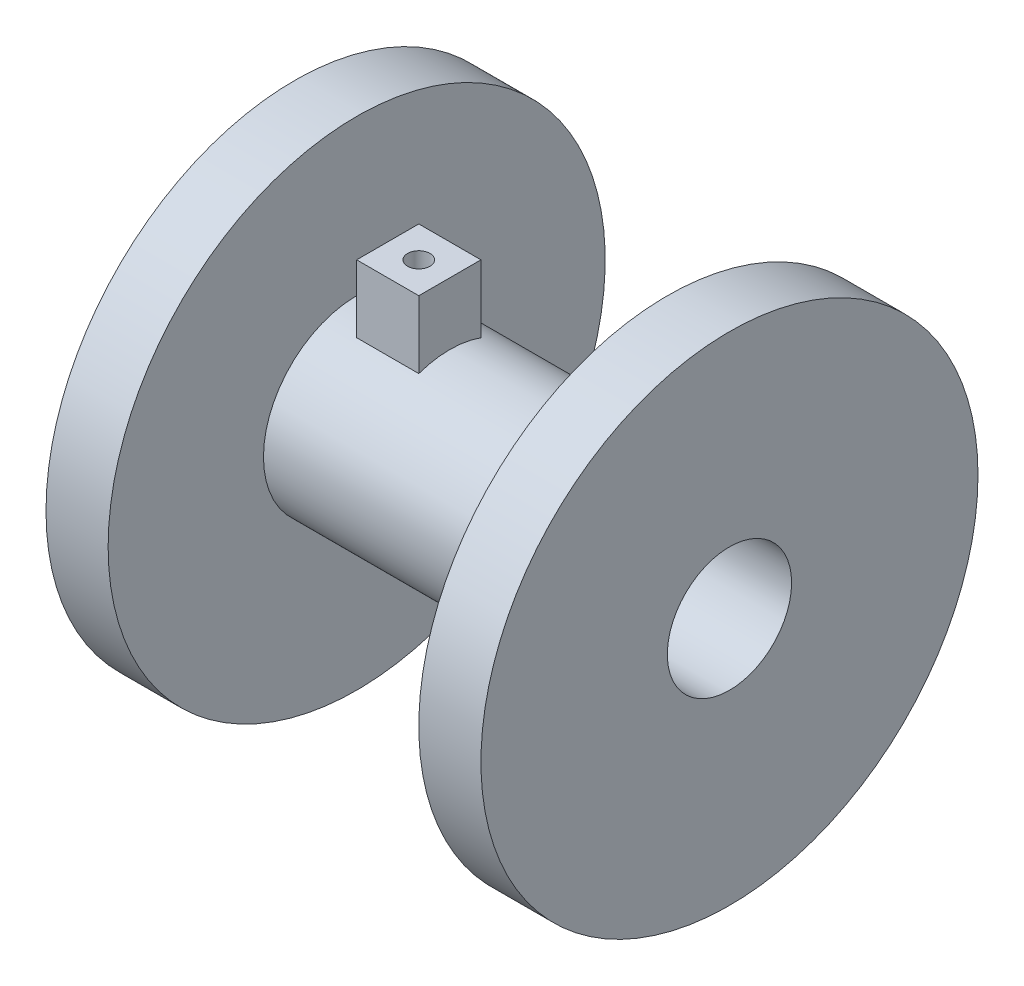
ISO-10303-21;
HEADER;
FILE_DESCRIPTION(('STEP AP214'),'2;1');
FILE_NAME('part.step','',(''),(''),'','','');
FILE_SCHEMA(('AUTOMOTIVE_DESIGN { 1 0 10303 214 1 1 1 1 }'));
ENDSEC;
DATA;
#1=APPLICATION_CONTEXT('core data for automotive mechanical design processes');
#2=APPLICATION_PROTOCOL_DEFINITION('international standard','automotive_design',2000,#1);
#3=PRODUCT_CONTEXT('',#1,'mechanical');
#4=PRODUCT('Part','Part','',(#3));
#5=PRODUCT_RELATED_PRODUCT_CATEGORY('part','',(#4));
#6=PRODUCT_DEFINITION_FORMATION('','',#4);
#7=PRODUCT_DEFINITION_CONTEXT('part definition',#1,'design');
#8=PRODUCT_DEFINITION('design','',#6,#7);
#9=PRODUCT_DEFINITION_SHAPE('','',#8);
#10=(LENGTH_UNIT() NAMED_UNIT(*) SI_UNIT(.MILLI.,.METRE.));
#11=(NAMED_UNIT(*) PLANE_ANGLE_UNIT() SI_UNIT($,.RADIAN.));
#12=(NAMED_UNIT(*) SI_UNIT($,.STERADIAN.) SOLID_ANGLE_UNIT());
#13=UNCERTAINTY_MEASURE_WITH_UNIT(LENGTH_MEASURE(1.E-05),#10,'distance_accuracy_value','');
#14=(GEOMETRIC_REPRESENTATION_CONTEXT(3) GLOBAL_UNCERTAINTY_ASSIGNED_CONTEXT((#13)) GLOBAL_UNIT_ASSIGNED_CONTEXT((#10,
#11,#12)) REPRESENTATION_CONTEXT('',''));
#15=CARTESIAN_POINT('',(0.,0.,0.));
#16=DIRECTION('',(0.,0.,1.));
#17=DIRECTION('',(1.,0.,0.));
#18=AXIS2_PLACEMENT_3D('',#15,#16,#17);
#19=CARTESIAN_POINT('',(44.45,0.,0.));
#20=DIRECTION('',(-1.,0.,0.));
#21=DIRECTION('',(0.,0.,1.));
#22=AXIS2_PLACEMENT_3D('',#19,#20,#21);
#23=CYLINDRICAL_SURFACE('',#22,19.05);
#24=CARTESIAN_POINT('',(-25.4,0.,0.));
#25=DIRECTION('',(-1.,0.,0.));
#26=DIRECTION('',(0.,0.,1.));
#27=AXIS2_PLACEMENT_3D('',#24,#25,#26);
#28=CIRCLE('',#27,19.05);
#29=CARTESIAN_POINT('',(-25.4,17.9605122421383,-6.35));
#30=VERTEX_POINT('',#29);
#31=CARTESIAN_POINT('',(-25.4,17.9605122421383,6.35));
#32=VERTEX_POINT('',#31);
#33=EDGE_CURVE('E110',#30,#32,#28,.F.);
#34=ORIENTED_EDGE('',*,*,#33,.F.);
#35=DIRECTION('',(-1.,0.,0.));
#36=VECTOR('',#35,1.);
#37=CARTESIAN_POINT('',(44.45,17.9605122421383,-6.35));
#38=LINE('',#37,#36);
#39=CARTESIAN_POINT('',(-12.7,17.9605122421549,-6.35));
#40=VERTEX_POINT('',#39);
#41=EDGE_CURVE('E100',#40,#30,#38,.T.);
#42=ORIENTED_EDGE('',*,*,#41,.F.);
#43=CARTESIAN_POINT('',(-12.7,0.,0.));
#44=DIRECTION('',(1.,0.,0.));
#45=DIRECTION('',(0.,0.,-1.));
#46=AXIS2_PLACEMENT_3D('',#43,#44,#45);
#47=CIRCLE('',#46,19.05);
#48=CARTESIAN_POINT('',(-12.7,17.9605122421549,6.35));
#49=VERTEX_POINT('',#48);
#50=EDGE_CURVE('E91',#49,#40,#47,.F.);
#51=ORIENTED_EDGE('',*,*,#50,.F.);
#52=DIRECTION('',(-1.,0.,0.));
#53=VECTOR('',#52,1.);
#54=CARTESIAN_POINT('',(44.45,17.9605122421383,6.35));
#55=LINE('',#54,#53);
#56=EDGE_CURVE('E106',#32,#49,#55,.F.);
#57=ORIENTED_EDGE('',*,*,#56,.F.);
#58=EDGE_LOOP('',(#34,#42,#51,#57));
#59=FACE_BOUND('',#58,.T.);
#60=CARTESIAN_POINT('',(31.75,0.,0.));
#61=DIRECTION('',(1.,0.,0.));
#62=DIRECTION('',(0.,0.,-1.));
#63=AXIS2_PLACEMENT_3D('',#60,#61,#62);
#64=CIRCLE('',#63,19.05);
#65=CARTESIAN_POINT('',(31.75,0.,-19.05));
#66=VERTEX_POINT('',#65);
#67=EDGE_CURVE('E130',#66,#66,#64,.T.);
#68=ORIENTED_EDGE('',*,*,#67,.F.);
#69=EDGE_LOOP('',(#68));
#70=FACE_BOUND('',#69,.T.);
#71=CARTESIAN_POINT('',(-31.75,0.,0.));
#72=DIRECTION('',(-1.,0.,0.));
#73=DIRECTION('',(0.,0.,1.));
#74=AXIS2_PLACEMENT_3D('',#71,#72,#73);
#75=CIRCLE('',#74,19.05);
#76=CARTESIAN_POINT('',(-31.75,0.,19.05));
#77=VERTEX_POINT('',#76);
#78=EDGE_CURVE('E57',#77,#77,#75,.T.);
#79=ORIENTED_EDGE('',*,*,#78,.F.);
#80=EDGE_LOOP('',(#79));
#81=FACE_BOUND('',#80,.T.);
#82=ADVANCED_FACE('F46',(#59,#70,#81),#23,.T.);
#83=CARTESIAN_POINT('',(44.45,0.,0.));
#84=DIRECTION('',(1.,0.,0.));
#85=DIRECTION('',(0.,0.,-1.));
#86=AXIS2_PLACEMENT_3D('',#83,#84,#85);
#87=PLANE('',#86);
#88=CARTESIAN_POINT('',(44.45,0.,0.));
#89=DIRECTION('',(1.,0.,0.));
#90=DIRECTION('',(0.,0.,-1.));
#91=AXIS2_PLACEMENT_3D('',#88,#89,#90);
#92=CIRCLE('',#91,12.7);
#93=CARTESIAN_POINT('',(44.45,0.,-12.7));
#94=VERTEX_POINT('',#93);
#95=EDGE_CURVE('E139',#94,#94,#92,.T.);
#96=ORIENTED_EDGE('',*,*,#95,.F.);
#97=EDGE_LOOP('',(#96));
#98=FACE_BOUND('',#97,.T.);
#99=CARTESIAN_POINT('',(44.45,0.,0.));
#100=DIRECTION('',(1.,0.,0.));
#101=DIRECTION('',(0.,0.,-1.));
#102=AXIS2_PLACEMENT_3D('',#99,#100,#101);
#103=CIRCLE('',#102,50.8);
#104=CARTESIAN_POINT('',(44.45,0.,-50.8));
#105=VERTEX_POINT('',#104);
#106=EDGE_CURVE('E123',#105,#105,#103,.T.);
#107=ORIENTED_EDGE('',*,*,#106,.T.);
#108=EDGE_LOOP('',(#107));
#109=FACE_BOUND('',#108,.T.);
#110=ADVANCED_FACE('F154',(#98,#109),#87,.T.);
#111=CARTESIAN_POINT('',(-44.45,0.,0.));
#112=DIRECTION('',(1.,0.,0.));
#113=DIRECTION('',(0.,0.,-1.));
#114=AXIS2_PLACEMENT_3D('',#111,#112,#113);
#115=PLANE('',#114);
#116=CARTESIAN_POINT('',(-44.45,0.,0.));
#117=DIRECTION('',(1.,0.,0.));
#118=DIRECTION('',(0.,0.,-1.));
#119=AXIS2_PLACEMENT_3D('',#116,#117,#118);
#120=CIRCLE('',#119,12.7);
#121=CARTESIAN_POINT('',(-44.45,0.,-12.7));
#122=VERTEX_POINT('',#121);
#123=EDGE_CURVE('E134',#122,#122,#120,.T.);
#124=ORIENTED_EDGE('',*,*,#123,.T.);
#125=EDGE_LOOP('',(#124));
#126=FACE_BOUND('',#125,.T.);
#127=CARTESIAN_POINT('',(-44.45,0.,0.));
#128=DIRECTION('',(-1.,0.,0.));
#129=DIRECTION('',(0.,0.,1.));
#130=AXIS2_PLACEMENT_3D('',#127,#128,#129);
#131=CIRCLE('',#130,50.8);
#132=CARTESIAN_POINT('',(-44.45,0.,50.8));
#133=VERTEX_POINT('',#132);
#134=EDGE_CURVE('E124',#133,#133,#131,.T.);
#135=ORIENTED_EDGE('',*,*,#134,.T.);
#136=EDGE_LOOP('',(#135));
#137=FACE_BOUND('',#136,.T.);
#138=ADVANCED_FACE('F144',(#126,#137),#115,.F.);
#139=CARTESIAN_POINT('',(44.45,0.,0.));
#140=DIRECTION('',(-1.,0.,0.));
#141=DIRECTION('',(0.,0.,1.));
#142=AXIS2_PLACEMENT_3D('',#139,#140,#141);
#143=CYLINDRICAL_SURFACE('',#142,12.7);
#144=ORIENTED_EDGE('',*,*,#123,.F.);
#145=EDGE_LOOP('',(#144));
#146=FACE_BOUND('',#145,.T.);
#147=ORIENTED_EDGE('',*,*,#95,.T.);
#148=EDGE_LOOP('',(#147));
#149=FACE_BOUND('',#148,.T.);
#150=ADVANCED_FACE('F147',(#146,#149),#143,.F.);
#151=CARTESIAN_POINT('',(31.75,0.,0.));
#152=DIRECTION('',(1.,0.,0.));
#153=DIRECTION('',(0.,0.,-1.));
#154=AXIS2_PLACEMENT_3D('',#151,#152,#153);
#155=PLANE('',#154);
#156=CARTESIAN_POINT('',(31.75,0.,0.));
#157=DIRECTION('',(1.,0.,0.));
#158=DIRECTION('',(0.,0.,-1.));
#159=AXIS2_PLACEMENT_3D('',#156,#157,#158);
#160=CIRCLE('',#159,50.8);
#161=CARTESIAN_POINT('',(31.75,0.,-50.8));
#162=VERTEX_POINT('',#161);
#163=EDGE_CURVE('E131',#162,#162,#160,.T.);
#164=ORIENTED_EDGE('',*,*,#163,.F.);
#165=EDGE_LOOP('',(#164));
#166=FACE_BOUND('',#165,.T.);
#167=ORIENTED_EDGE('',*,*,#67,.T.);
#168=EDGE_LOOP('',(#167));
#169=FACE_BOUND('',#168,.T.);
#170=ADVANCED_FACE('F150',(#166,#169),#155,.F.);
#171=CARTESIAN_POINT('',(31.75,0.,0.));
#172=DIRECTION('',(1.,0.,0.));
#173=DIRECTION('',(0.,0.,-1.));
#174=AXIS2_PLACEMENT_3D('',#171,#172,#173);
#175=CYLINDRICAL_SURFACE('',#174,50.8);
#176=ORIENTED_EDGE('',*,*,#163,.T.);
#177=EDGE_LOOP('',(#176));
#178=FACE_BOUND('',#177,.T.);
#179=ORIENTED_EDGE('',*,*,#106,.F.);
#180=EDGE_LOOP('',(#179));
#181=FACE_BOUND('',#180,.T.);
#182=ADVANCED_FACE('F160',(#178,#181),#175,.T.);
#183=CARTESIAN_POINT('',(-31.75,0.,0.));
#184=DIRECTION('',(-1.,0.,0.));
#185=DIRECTION('',(0.,0.,1.));
#186=AXIS2_PLACEMENT_3D('',#183,#184,#185);
#187=PLANE('',#186);
#188=CARTESIAN_POINT('',(-31.75,0.,0.));
#189=DIRECTION('',(-1.,0.,0.));
#190=DIRECTION('',(0.,0.,1.));
#191=AXIS2_PLACEMENT_3D('',#188,#189,#190);
#192=CIRCLE('',#191,50.8);
#193=CARTESIAN_POINT('',(-31.75,0.,50.8));
#194=VERTEX_POINT('',#193);
#195=EDGE_CURVE('E120',#194,#194,#192,.T.);
#196=ORIENTED_EDGE('',*,*,#195,.F.);
#197=EDGE_LOOP('',(#196));
#198=FACE_BOUND('',#197,.T.);
#199=ORIENTED_EDGE('',*,*,#78,.T.);
#200=EDGE_LOOP('',(#199));
#201=FACE_BOUND('',#200,.T.);
#202=ADVANCED_FACE('F162',(#198,#201),#187,.F.);
#203=CARTESIAN_POINT('',(-31.75,0.,0.));
#204=DIRECTION('',(-1.,0.,0.));
#205=DIRECTION('',(0.,0.,1.));
#206=AXIS2_PLACEMENT_3D('',#203,#204,#205);
#207=CYLINDRICAL_SURFACE('',#206,50.8);
#208=ORIENTED_EDGE('',*,*,#195,.T.);
#209=EDGE_LOOP('',(#208));
#210=FACE_BOUND('',#209,.T.);
#211=ORIENTED_EDGE('',*,*,#134,.F.);
#212=EDGE_LOOP('',(#211));
#213=FACE_BOUND('',#212,.T.);
#214=ADVANCED_FACE('F169',(#210,#213),#207,.T.);
#215=CARTESIAN_POINT('',(-25.4,-500000.,-6.35));
#216=DIRECTION('',(0.,0.,-1.));
#217=DIRECTION('',(-1.,0.,0.));
#218=AXIS2_PLACEMENT_3D('',#215,#216,#217);
#219=PLANE('',#218);
#220=DIRECTION('',(0.,1.,0.));
#221=VECTOR('',#220,1.);
#222=CARTESIAN_POINT('',(-12.7,-500000.,-6.35));
#223=LINE('',#222,#221);
#224=CARTESIAN_POINT('',(-12.7,31.75,-6.35));
#225=VERTEX_POINT('',#224);
#226=EDGE_CURVE('E95',#40,#225,#223,.T.);
#227=ORIENTED_EDGE('',*,*,#226,.F.);
#228=ORIENTED_EDGE('',*,*,#41,.T.);
#229=DIRECTION('',(0.,1.,0.));
#230=VECTOR('',#229,1.);
#231=CARTESIAN_POINT('',(-25.4,-500000.,-6.35));
#232=LINE('',#231,#230);
#233=CARTESIAN_POINT('',(-25.4,31.75,-6.35));
#234=VERTEX_POINT('',#233);
#235=EDGE_CURVE('E72',#30,#234,#232,.T.);
#236=ORIENTED_EDGE('',*,*,#235,.T.);
#237=DIRECTION('',(-1.,0.,0.));
#238=VECTOR('',#237,1.);
#239=CARTESIAN_POINT('',(-25.4,31.75,-6.35));
#240=LINE('',#239,#238);
#241=EDGE_CURVE('E104',#225,#234,#240,.T.);
#242=ORIENTED_EDGE('',*,*,#241,.F.);
#243=EDGE_LOOP('',(#227,#228,#236,#242));
#244=FACE_BOUND('',#243,.T.);
#245=ADVANCED_FACE('F102',(#244),#219,.T.);
#246=CARTESIAN_POINT('',(-12.7,31.75,-6.35));
#247=DIRECTION('',(0.,-1.,0.));
#248=DIRECTION('',(0.,0.,-1.));
#249=AXIS2_PLACEMENT_3D('',#246,#247,#248);
#250=PLANE('',#249);
#251=DIRECTION('',(0.,0.,-1.));
#252=VECTOR('',#251,1.);
#253=CARTESIAN_POINT('',(-12.7,31.75,6.35));
#254=LINE('',#253,#252);
#255=CARTESIAN_POINT('',(-12.7,31.75,6.35));
#256=VERTEX_POINT('',#255);
#257=EDGE_CURVE('E127',#256,#225,#254,.T.);
#258=ORIENTED_EDGE('',*,*,#257,.T.);
#259=ORIENTED_EDGE('',*,*,#241,.T.);
#260=DIRECTION('',(0.,0.,1.));
#261=VECTOR('',#260,1.);
#262=CARTESIAN_POINT('',(-25.4,31.75,6.35));
#263=LINE('',#262,#261);
#264=CARTESIAN_POINT('',(-25.4,31.75,6.35));
#265=VERTEX_POINT('',#264);
#266=EDGE_CURVE('E210',#234,#265,#263,.T.);
#267=ORIENTED_EDGE('',*,*,#266,.T.);
#268=DIRECTION('',(1.,0.,0.));
#269=VECTOR('',#268,1.);
#270=CARTESIAN_POINT('',(-25.4,31.75,6.35));
#271=LINE('',#270,#269);
#272=EDGE_CURVE('E212',#265,#256,#271,.T.);
#273=ORIENTED_EDGE('',*,*,#272,.T.);
#274=EDGE_LOOP('',(#258,#259,#267,#273));
#275=FACE_BOUND('',#274,.T.);
#276=CARTESIAN_POINT('',(-19.05,31.75,0.));
#277=DIRECTION('',(0.,1.,0.));
#278=DIRECTION('',(0.,0.,1.));
#279=AXIS2_PLACEMENT_3D('',#276,#277,#278);
#280=CIRCLE('',#279,2.286);
#281=CARTESIAN_POINT('',(-19.05,31.75,2.286));
#282=VERTEX_POINT('',#281);
#283=EDGE_CURVE('E117',#282,#282,#280,.T.);
#284=ORIENTED_EDGE('',*,*,#283,.F.);
#285=EDGE_LOOP('',(#284));
#286=FACE_BOUND('',#285,.T.);
#287=ADVANCED_FACE('F188',(#275,#286),#250,.F.);
#288=CARTESIAN_POINT('',(-19.05,-500000.,0.));
#289=DIRECTION('',(0.,1.,0.));
#290=DIRECTION('',(0.,0.,1.));
#291=AXIS2_PLACEMENT_3D('',#288,#289,#290);
#292=CYLINDRICAL_SURFACE('',#291,2.286);
#293=ORIENTED_EDGE('',*,*,#283,.T.);
#294=EDGE_LOOP('',(#293));
#295=FACE_BOUND('',#294,.T.);
#296=CARTESIAN_POINT('',(-19.05,18.9123426364901,2.286));
#297=CARTESIAN_POINT('',(-19.1779086655937,18.912344408558,2.28599453777581));
#298=CARTESIAN_POINT('',(-19.305898284354,18.9136542560225,2.27522847083811));
#299=CARTESIAN_POINT('',(-19.5583184743883,18.9187504146085,2.23244906856361));
#300=CARTESIAN_POINT('',(-19.682745137113,18.9225393442396,2.20041326672093));
#301=CARTESIAN_POINT('',(-19.9243480649944,18.93215846091,2.11604987977414));
#302=CARTESIAN_POINT('',(-20.0415290769839,18.9379872945147,2.06373574645828));
#303=CARTESIAN_POINT('',(-20.2654259222828,18.9510278203983,1.94032889219113));
#304=CARTESIAN_POINT('',(-20.3721436027753,18.9582392679255,1.86923949401545));
#305=CARTESIAN_POINT('',(-20.5726587059664,18.9732742241852,1.709906236747));
#306=CARTESIAN_POINT('',(-20.6663942482935,18.9811004032235,1.62158474704995));
#307=CARTESIAN_POINT('',(-20.8377500832395,18.9964589528062,1.43046134863375));
#308=CARTESIAN_POINT('',(-20.9153695884877,19.0039913089809,1.32765873283125));
#309=CARTESIAN_POINT('',(-21.0525104980974,19.0179406805588,1.11010413117261));
#310=CARTESIAN_POINT('',(-21.1119761267936,19.0243542332071,0.995316744832935));
#311=CARTESIAN_POINT('',(-21.2107641268132,19.0353140687346,0.757295234661857));
#312=CARTESIAN_POINT('',(-21.2500871896678,19.0398604157173,0.634061400977185));
#313=CARTESIAN_POINT('',(-21.3072895591508,19.0465547941289,0.383276747022637));
#314=CARTESIAN_POINT('',(-21.3252715379257,19.0487143051679,0.255749656935058));
#315=CARTESIAN_POINT('',(-21.3395993826746,19.0504308626969,-0.000529206461443951));
#316=CARTESIAN_POINT('',(-21.3359460368046,19.049988003989,-0.129280934987272));
#317=CARTESIAN_POINT('',(-21.3071894491493,19.0465590309053,-0.383656078648356));
#318=CARTESIAN_POINT('',(-21.282196624011,19.0435860085866,-0.509292177426976));
#319=CARTESIAN_POINT('',(-21.2116430083924,19.0354455273854,-0.754573830009475));
#320=CARTESIAN_POINT('',(-21.1660818530336,19.0302780295735,-0.874219277498462));
#321=CARTESIAN_POINT('',(-21.0555666805732,19.018306736327,-1.10446651592364));
#322=CARTESIAN_POINT('',(-20.9905646461631,19.0114988975783,-1.21504504052384));
#323=CARTESIAN_POINT('',(-20.8430477989954,18.9970090696977,-1.42376569719147));
#324=CARTESIAN_POINT('',(-20.7605322458713,18.9893270436166,-1.52190730322037));
#325=CARTESIAN_POINT('',(-20.5797116856502,18.9738919539915,-1.70361651495763));
#326=CARTESIAN_POINT('',(-20.4813104865934,18.9661387477997,-1.78708841625324));
#327=CARTESIAN_POINT('',(-20.2718429865762,18.9514830047109,-1.93634556970769));
#328=CARTESIAN_POINT('',(-20.1607766513167,18.9445804701177,-2.0021307739666));
#329=CARTESIAN_POINT('',(-19.9290489225077,18.9324075546074,-2.11415130909291));
#330=CARTESIAN_POINT('',(-19.8083839737615,18.927137782014,-2.16037935582122));
#331=CARTESIAN_POINT('',(-19.5609268220601,18.9188390969638,-2.23189045644671));
#332=CARTESIAN_POINT('',(-19.4341348907691,18.9158100852509,-2.25717443808216));
#333=CARTESIAN_POINT('',(-19.178867080561,18.9123538451915,-2.2859537367867));
#334=CARTESIAN_POINT('',(-19.0504065758586,18.9119105551203,-2.28958356614328));
#335=CARTESIAN_POINT('',(-18.7947080689977,18.9136334935473,-2.27530607718369));
#336=CARTESIAN_POINT('',(-18.6674700429222,18.9157996708879,-2.25739918108731));
#337=CARTESIAN_POINT('',(-18.4182290128983,18.9224828261534,-2.20066965459818));
#338=CARTESIAN_POINT('',(-18.2962110477313,18.9269925194845,-2.1619118242419));
#339=CARTESIAN_POINT('',(-18.0604063863723,18.9378486764175,-2.06464720515979));
#340=CARTESIAN_POINT('',(-17.9466199579687,18.9441951997416,-2.00613977429062));
#341=CARTESIAN_POINT('',(-17.7298987832293,18.9580484932734,-1.87070468673867));
#342=CARTESIAN_POINT('',(-17.6270196453964,18.965560769071,-1.79368861841805));
#343=CARTESIAN_POINT('',(-17.435600043885,18.9808816881761,-1.62354781591571));
#344=CARTESIAN_POINT('',(-17.3470600936647,18.988690342084,-1.53042250514039));
#345=CARTESIAN_POINT('',(-17.186361552607,19.0037733420022,-1.3301199757728));
#346=CARTESIAN_POINT('',(-17.1142912121583,19.0110446745095,-1.22287169655639));
#347=CARTESIAN_POINT('',(-16.9891876044912,19.0241889592544,-0.99771435921086));
#348=CARTESIAN_POINT('',(-16.9361539795107,19.0300619377709,-0.879805501481044));
#349=CARTESIAN_POINT('',(-16.8507757942846,19.0397343688052,-0.636970464476628));
#350=CARTESIAN_POINT('',(-16.8183797338482,19.0435389793403,-0.51206260603315));
#351=CARTESIAN_POINT('',(-16.7750286213904,19.0486673659754,-0.258531805763503));
#352=CARTESIAN_POINT('',(-16.7640726820798,19.0499912447393,-0.129909017901478));
#353=CARTESIAN_POINT('',(-16.7639284907864,19.0500086143069,0.126537724766815));
#354=CARTESIAN_POINT('',(-16.7746039640474,19.048718572432,0.254361623350062));
#355=CARTESIAN_POINT('',(-16.8171315586357,19.0436857176378,0.506384985294732));
#356=CARTESIAN_POINT('',(-16.8489836730215,19.0399429055226,0.630584449844192));
#357=CARTESIAN_POINT('',(-16.9329186475303,19.0304233070851,0.871819101659518));
#358=CARTESIAN_POINT('',(-16.9849955177143,19.0246471230312,0.988856398265977));
#359=CARTESIAN_POINT('',(-17.1078876050233,19.0117013041689,1.21255186282029));
#360=CARTESIAN_POINT('',(-17.178702973795,19.0045316580837,1.3192099467618));
#361=CARTESIAN_POINT('',(-17.3375678256888,18.9895459194044,1.51981622699742));
#362=CARTESIAN_POINT('',(-17.4257187847582,18.9817261850178,1.61368379412212));
#363=CARTESIAN_POINT('',(-17.6165431543101,18.9663512110822,1.78534870802856));
#364=CARTESIAN_POINT('',(-17.71922000815,18.9587960347779,1.86314223367573));
#365=CARTESIAN_POINT('',(-17.9365983173619,18.9447768836122,2.00068490943304));
#366=CARTESIAN_POINT('',(-18.0513413381441,18.938316895173,2.06036873828634));
#367=CARTESIAN_POINT('',(-18.289232728358,18.9272663651129,2.15953700037695));
#368=CARTESIAN_POINT('',(-18.4123717130524,18.9226737749139,2.19904358076642));
#369=CARTESIAN_POINT('',(-18.6218013687985,18.9170025954451,2.2471914167611));
#370=CARTESIAN_POINT('',(-18.706766816994,18.915263716976,2.26172393685751));
#371=CARTESIAN_POINT('',(-18.8778092842857,18.9129331448691,2.28113003445061));
#372=CARTESIAN_POINT('',(-18.9638862958445,18.9123414434565,2.28600367740806));
#373=CARTESIAN_POINT('',(-19.05,18.9123426364901,2.286));
#374=B_SPLINE_CURVE_WITH_KNOTS('',3,(#296,#297,#298,#299,#300,#301,#302,#303,#304,#305,#306,
#307,#308,#309,#310,#311,#312,#313,#314,#315,#316,#317,#318,#319,#320,#321,#322,#323,#324,#325,
#326,#327,#328,#329,#330,#331,#332,#333,#334,#335,#336,#337,#338,#339,#340,#341,#342,#343,#344,
#345,#346,#347,#348,#349,#350,#351,#352,#353,#354,#355,#356,#357,#358,#359,#360,#361,#362,#363,
#364,#365,#366,#367,#368,#369,#370,#371,#372,#373),.UNSPECIFIED.,.T.,.F.,(4,2,2,2,2,2,2,2,2,2,2,
2,2,2,2,2,2,2,2,2,2,2,2,2,2,2,2,2,2,2,2,2,2,2,2,2,2,2,4),(0.,0.383411435283489,
0.767228500844914,1.15079139290421,1.53428644888261,1.91955079632443,2.30483396195011,
2.69128922058225,3.07773121060774,3.46230638920699,3.84686755815667,4.22945087174949,
4.61204097256712,4.99558395362745,5.37914315181536,5.76511860241568,6.151095098322,
6.53721522637588,6.92331824993848,7.30702034215786,7.69071491215762,8.07322387614279,
8.45574527831598,8.84013154738719,9.22453157753645,9.6109454412503,9.99735204260288,
10.3827905654185,10.7682131367071,11.1512151515318,11.5342170408127,11.9171055833357,
12.2999972245899,12.6852007214437,13.0704956841092,13.457164313692,13.8434076071192,
14.1015386924649,14.3596680283826),.UNSPECIFIED.);
#375=CARTESIAN_POINT('',(-19.05,18.9123426364901,2.286));
#376=VERTEX_POINT('',#375);
#377=EDGE_CURVE('E12',#376,#376,#374,.T.);
#378=ORIENTED_EDGE('',*,*,#377,.T.);
#379=EDGE_LOOP('',(#378));
#380=FACE_BOUND('',#379,.T.);
#381=ADVANCED_FACE('F194',(#295,#380),#292,.F.);
#382=CARTESIAN_POINT('',(-12.7,-500000.,6.35));
#383=DIRECTION('',(1.,0.,0.));
#384=DIRECTION('',(0.,0.,-1.));
#385=AXIS2_PLACEMENT_3D('',#382,#383,#384);
#386=PLANE('',#385);
#387=DIRECTION('',(0.,1.,0.));
#388=VECTOR('',#387,1.);
#389=CARTESIAN_POINT('',(-12.7,-500000.,6.35));
#390=LINE('',#389,#388);
#391=EDGE_CURVE('E96',#49,#256,#390,.T.);
#392=ORIENTED_EDGE('',*,*,#391,.F.);
#393=ORIENTED_EDGE('',*,*,#50,.T.);
#394=ORIENTED_EDGE('',*,*,#226,.T.);
#395=ORIENTED_EDGE('',*,*,#257,.F.);
#396=EDGE_LOOP('',(#392,#393,#394,#395));
#397=FACE_BOUND('',#396,.T.);
#398=ADVANCED_FACE('F93',(#397),#386,.T.);
#399=CARTESIAN_POINT('',(-25.4,-500000.,6.35));
#400=DIRECTION('',(-1.,0.,0.));
#401=DIRECTION('',(0.,0.,1.));
#402=AXIS2_PLACEMENT_3D('',#399,#400,#401);
#403=PLANE('',#402);
#404=ORIENTED_EDGE('',*,*,#235,.F.);
#405=ORIENTED_EDGE('',*,*,#33,.T.);
#406=DIRECTION('',(0.,1.,0.));
#407=VECTOR('',#406,1.);
#408=CARTESIAN_POINT('',(-25.4,-500000.,6.35));
#409=LINE('',#408,#407);
#410=EDGE_CURVE('E64',#32,#265,#409,.T.);
#411=ORIENTED_EDGE('',*,*,#410,.T.);
#412=ORIENTED_EDGE('',*,*,#266,.F.);
#413=EDGE_LOOP('',(#404,#405,#411,#412));
#414=FACE_BOUND('',#413,.T.);
#415=ADVANCED_FACE('F184',(#414),#403,.T.);
#416=CARTESIAN_POINT('',(-25.4,-500000.,6.35));
#417=DIRECTION('',(0.,0.,1.));
#418=DIRECTION('',(1.,0.,0.));
#419=AXIS2_PLACEMENT_3D('',#416,#417,#418);
#420=PLANE('',#419);
#421=ORIENTED_EDGE('',*,*,#410,.F.);
#422=ORIENTED_EDGE('',*,*,#56,.T.);
#423=ORIENTED_EDGE('',*,*,#391,.T.);
#424=ORIENTED_EDGE('',*,*,#272,.F.);
#425=EDGE_LOOP('',(#421,#422,#423,#424));
#426=FACE_BOUND('',#425,.T.);
#427=ADVANCED_FACE('F179',(#426),#420,.T.);
#428=ORIENTED_EDGE('',*,*,#377,.F.);
#429=EDGE_LOOP('',(#428));
#430=FACE_BOUND('',#429,.T.);
#431=ADVANCED_FACE('F175',(#430),#23,.T.);
#432=CLOSED_SHELL('',(#82,#110,#138,#150,#170,#182,#202,#214,#245,#287,#381,#398,#415,#427,#431));
#433=MANIFOLD_SOLID_BREP('B2',#432);
#434=ADVANCED_BREP_SHAPE_REPRESENTATION('',(#18,#433),#14);
#435=SHAPE_DEFINITION_REPRESENTATION(#9,#434);
ENDSEC;
END-ISO-10303-21;
